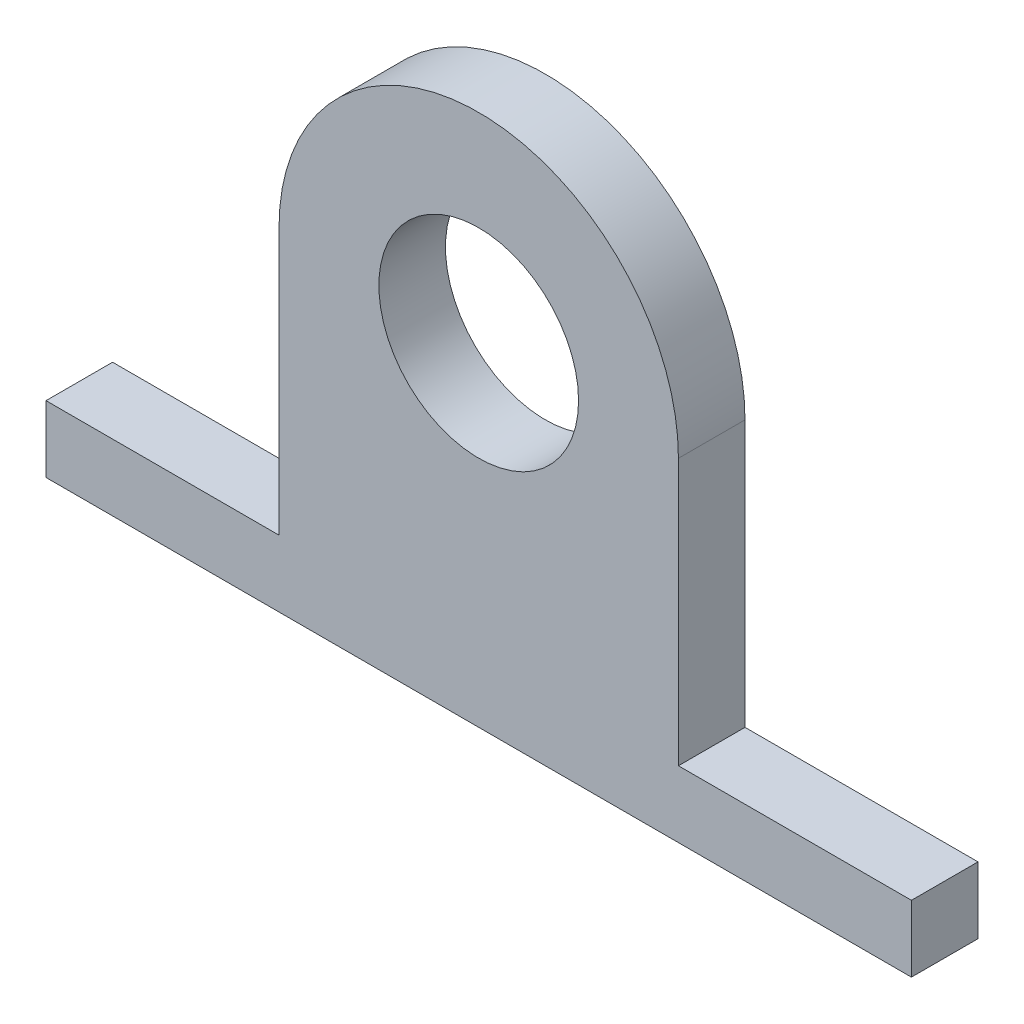
ISO-10303-21;
HEADER;
FILE_DESCRIPTION(('STEP AP214'),'2;1');
FILE_NAME('part.step','',(''),(''),'','','');
FILE_SCHEMA(('AUTOMOTIVE_DESIGN { 1 0 10303 214 1 1 1 1 }'));
ENDSEC;
DATA;
#1=APPLICATION_CONTEXT('core data for automotive mechanical design processes');
#2=APPLICATION_PROTOCOL_DEFINITION('international standard','automotive_design',2000,#1);
#3=PRODUCT_CONTEXT('',#1,'mechanical');
#4=PRODUCT('Part','Part','',(#3));
#5=PRODUCT_RELATED_PRODUCT_CATEGORY('part','',(#4));
#6=PRODUCT_DEFINITION_FORMATION('','',#4);
#7=PRODUCT_DEFINITION_CONTEXT('part definition',#1,'design');
#8=PRODUCT_DEFINITION('design','',#6,#7);
#9=PRODUCT_DEFINITION_SHAPE('','',#8);
#10=(LENGTH_UNIT() NAMED_UNIT(*) SI_UNIT(.MILLI.,.METRE.));
#11=(NAMED_UNIT(*) PLANE_ANGLE_UNIT() SI_UNIT($,.RADIAN.));
#12=(NAMED_UNIT(*) SI_UNIT($,.STERADIAN.) SOLID_ANGLE_UNIT());
#13=UNCERTAINTY_MEASURE_WITH_UNIT(LENGTH_MEASURE(1.E-05),#10,'distance_accuracy_value','');
#14=(GEOMETRIC_REPRESENTATION_CONTEXT(3) GLOBAL_UNCERTAINTY_ASSIGNED_CONTEXT((#13)) GLOBAL_UNIT_ASSIGNED_CONTEXT((#10,
#11,#12)) REPRESENTATION_CONTEXT('',''));
#15=CARTESIAN_POINT('',(0.,0.,0.));
#16=DIRECTION('',(0.,0.,1.));
#17=DIRECTION('',(1.,0.,0.));
#18=AXIS2_PLACEMENT_3D('',#15,#16,#17);
#19=CARTESIAN_POINT('',(0.,50.,10.));
#20=DIRECTION('',(0.,0.,1.));
#21=DIRECTION('',(1.,0.,0.));
#22=AXIS2_PLACEMENT_3D('',#19,#20,#21);
#23=PLANE('',#22);
#24=DIRECTION('',(0.,-1.,0.));
#25=VECTOR('',#24,1.);
#26=CARTESIAN_POINT('',(-65.,0.,10.));
#27=LINE('',#26,#25);
#28=CARTESIAN_POINT('',(-65.,10.,10.));
#29=VERTEX_POINT('',#28);
#30=CARTESIAN_POINT('',(-65.,0.,10.));
#31=VERTEX_POINT('',#30);
#32=EDGE_CURVE('E145',#29,#31,#27,.T.);
#33=ORIENTED_EDGE('',*,*,#32,.T.);
#34=DIRECTION('',(1.,0.,0.));
#35=VECTOR('',#34,1.);
#36=CARTESIAN_POINT('',(-65.,0.,10.));
#37=LINE('',#36,#35);
#38=CARTESIAN_POINT('',(65.,0.,10.));
#39=VERTEX_POINT('',#38);
#40=EDGE_CURVE('E93',#31,#39,#37,.T.);
#41=ORIENTED_EDGE('',*,*,#40,.T.);
#42=DIRECTION('',(0.,1.,0.));
#43=VECTOR('',#42,1.);
#44=CARTESIAN_POINT('',(65.,0.,10.));
#45=LINE('',#44,#43);
#46=CARTESIAN_POINT('',(65.,10.,10.));
#47=VERTEX_POINT('',#46);
#48=EDGE_CURVE('E160',#39,#47,#45,.T.);
#49=ORIENTED_EDGE('',*,*,#48,.T.);
#50=DIRECTION('',(-1.,0.,0.));
#51=VECTOR('',#50,1.);
#52=CARTESIAN_POINT('',(65.,10.,10.));
#53=LINE('',#52,#51);
#54=CARTESIAN_POINT('',(30.,10.,10.));
#55=VERTEX_POINT('',#54);
#56=EDGE_CURVE('E173',#47,#55,#53,.T.);
#57=ORIENTED_EDGE('',*,*,#56,.T.);
#58=DIRECTION('',(0.,1.,0.));
#59=VECTOR('',#58,1.);
#60=CARTESIAN_POINT('',(30.,10.,10.));
#61=LINE('',#60,#59);
#62=CARTESIAN_POINT('',(30.,50.,10.));
#63=VERTEX_POINT('',#62);
#64=EDGE_CURVE('E112',#55,#63,#61,.T.);
#65=ORIENTED_EDGE('',*,*,#64,.T.);
#66=CARTESIAN_POINT('',(0.,50.,10.));
#67=DIRECTION('',(0.,0.,1.));
#68=DIRECTION('',(1.,0.,0.));
#69=AXIS2_PLACEMENT_3D('',#66,#67,#68);
#70=CIRCLE('',#69,30.);
#71=CARTESIAN_POINT('',(-30.,50.,10.));
#72=VERTEX_POINT('',#71);
#73=EDGE_CURVE('E106',#63,#72,#70,.T.);
#74=ORIENTED_EDGE('',*,*,#73,.T.);
#75=DIRECTION('',(0.,-1.,0.));
#76=VECTOR('',#75,1.);
#77=CARTESIAN_POINT('',(-30.,10.,10.));
#78=LINE('',#77,#76);
#79=CARTESIAN_POINT('',(-30.,10.,10.));
#80=VERTEX_POINT('',#79);
#81=EDGE_CURVE('E110',#72,#80,#78,.T.);
#82=ORIENTED_EDGE('',*,*,#81,.T.);
#83=DIRECTION('',(-1.,0.,0.));
#84=VECTOR('',#83,1.);
#85=CARTESIAN_POINT('',(-65.,10.,10.));
#86=LINE('',#85,#84);
#87=EDGE_CURVE('E50',#80,#29,#86,.T.);
#88=ORIENTED_EDGE('',*,*,#87,.T.);
#89=EDGE_LOOP('',(#33,#41,#49,#57,#65,#74,#82,#88));
#90=FACE_BOUND('',#89,.T.);
#91=CARTESIAN_POINT('',(0.,50.,10.));
#92=DIRECTION('',(0.,0.,1.));
#93=DIRECTION('',(1.,0.,0.));
#94=AXIS2_PLACEMENT_3D('',#91,#92,#93);
#95=CIRCLE('',#94,15.);
#96=CARTESIAN_POINT('',(15.,50.,10.));
#97=VERTEX_POINT('',#96);
#98=EDGE_CURVE('E134',#97,#97,#95,.T.);
#99=ORIENTED_EDGE('',*,*,#98,.F.);
#100=EDGE_LOOP('',(#99));
#101=FACE_BOUND('',#100,.T.);
#102=ADVANCED_FACE('F33',(#90,#101),#23,.T.);
#103=CARTESIAN_POINT('',(0.,50.,0.));
#104=DIRECTION('',(0.,0.,1.));
#105=DIRECTION('',(1.,0.,0.));
#106=AXIS2_PLACEMENT_3D('',#103,#104,#105);
#107=PLANE('',#106);
#108=DIRECTION('',(0.,-1.,0.));
#109=VECTOR('',#108,1.);
#110=CARTESIAN_POINT('',(-65.,0.,0.));
#111=LINE('',#110,#109);
#112=CARTESIAN_POINT('',(-65.,10.,0.));
#113=VERTEX_POINT('',#112);
#114=CARTESIAN_POINT('',(-65.,0.,0.));
#115=VERTEX_POINT('',#114);
#116=EDGE_CURVE('E130',#113,#115,#111,.T.);
#117=ORIENTED_EDGE('',*,*,#116,.F.);
#118=DIRECTION('',(-1.,0.,0.));
#119=VECTOR('',#118,1.);
#120=CARTESIAN_POINT('',(-65.,10.,0.));
#121=LINE('',#120,#119);
#122=CARTESIAN_POINT('',(-30.,10.,0.));
#123=VERTEX_POINT('',#122);
#124=EDGE_CURVE('E85',#123,#113,#121,.T.);
#125=ORIENTED_EDGE('',*,*,#124,.F.);
#126=DIRECTION('',(0.,-1.,0.));
#127=VECTOR('',#126,1.);
#128=CARTESIAN_POINT('',(-30.,10.,0.));
#129=LINE('',#128,#127);
#130=CARTESIAN_POINT('',(-30.,50.,0.));
#131=VERTEX_POINT('',#130);
#132=EDGE_CURVE('E79',#131,#123,#129,.T.);
#133=ORIENTED_EDGE('',*,*,#132,.F.);
#134=CARTESIAN_POINT('',(0.,50.,0.));
#135=DIRECTION('',(0.,0.,1.));
#136=DIRECTION('',(1.,0.,0.));
#137=AXIS2_PLACEMENT_3D('',#134,#135,#136);
#138=CIRCLE('',#137,30.);
#139=CARTESIAN_POINT('',(30.,50.,0.));
#140=VERTEX_POINT('',#139);
#141=EDGE_CURVE('E120',#140,#131,#138,.T.);
#142=ORIENTED_EDGE('',*,*,#141,.F.);
#143=DIRECTION('',(0.,1.,0.));
#144=VECTOR('',#143,1.);
#145=CARTESIAN_POINT('',(30.,10.,0.));
#146=LINE('',#145,#144);
#147=CARTESIAN_POINT('',(30.,10.,0.));
#148=VERTEX_POINT('',#147);
#149=EDGE_CURVE('E140',#148,#140,#146,.T.);
#150=ORIENTED_EDGE('',*,*,#149,.F.);
#151=DIRECTION('',(-1.,0.,0.));
#152=VECTOR('',#151,1.);
#153=CARTESIAN_POINT('',(65.,10.,0.));
#154=LINE('',#153,#152);
#155=CARTESIAN_POINT('',(65.,10.,0.));
#156=VERTEX_POINT('',#155);
#157=EDGE_CURVE('E138',#156,#148,#154,.T.);
#158=ORIENTED_EDGE('',*,*,#157,.F.);
#159=DIRECTION('',(0.,1.,0.));
#160=VECTOR('',#159,1.);
#161=CARTESIAN_POINT('',(65.,0.,0.));
#162=LINE('',#161,#160);
#163=CARTESIAN_POINT('',(65.,0.,0.));
#164=VERTEX_POINT('',#163);
#165=EDGE_CURVE('E136',#164,#156,#162,.T.);
#166=ORIENTED_EDGE('',*,*,#165,.F.);
#167=DIRECTION('',(1.,0.,0.));
#168=VECTOR('',#167,1.);
#169=CARTESIAN_POINT('',(-65.,0.,0.));
#170=LINE('',#169,#168);
#171=EDGE_CURVE('E133',#115,#164,#170,.T.);
#172=ORIENTED_EDGE('',*,*,#171,.F.);
#173=EDGE_LOOP('',(#117,#125,#133,#142,#150,#158,#166,#172));
#174=FACE_BOUND('',#173,.T.);
#175=CARTESIAN_POINT('',(0.,50.,0.));
#176=DIRECTION('',(0.,0.,1.));
#177=DIRECTION('',(1.,0.,0.));
#178=AXIS2_PLACEMENT_3D('',#175,#176,#177);
#179=CIRCLE('',#178,15.);
#180=CARTESIAN_POINT('',(15.,50.,0.));
#181=VERTEX_POINT('',#180);
#182=EDGE_CURVE('E179',#181,#181,#179,.T.);
#183=ORIENTED_EDGE('',*,*,#182,.T.);
#184=EDGE_LOOP('',(#183));
#185=FACE_BOUND('',#184,.T.);
#186=ADVANCED_FACE('F164',(#174,#185),#107,.F.);
#187=CARTESIAN_POINT('',(-65.,0.,10.));
#188=DIRECTION('',(1.,0.,0.));
#189=DIRECTION('',(0.,0.,-1.));
#190=AXIS2_PLACEMENT_3D('',#187,#188,#189);
#191=PLANE('',#190);
#192=ORIENTED_EDGE('',*,*,#116,.T.);
#193=DIRECTION('',(0.,0.,-1.));
#194=VECTOR('',#193,1.);
#195=CARTESIAN_POINT('',(-65.,0.,10.));
#196=LINE('',#195,#194);
#197=EDGE_CURVE('E11',#31,#115,#196,.T.);
#198=ORIENTED_EDGE('',*,*,#197,.F.);
#199=ORIENTED_EDGE('',*,*,#32,.F.);
#200=DIRECTION('',(0.,0.,-1.));
#201=VECTOR('',#200,1.);
#202=CARTESIAN_POINT('',(-65.,10.,10.));
#203=LINE('',#202,#201);
#204=EDGE_CURVE('E126',#29,#113,#203,.T.);
#205=ORIENTED_EDGE('',*,*,#204,.T.);
#206=EDGE_LOOP('',(#192,#198,#199,#205));
#207=FACE_BOUND('',#206,.T.);
#208=ADVANCED_FACE('F35',(#207),#191,.F.);
#209=CARTESIAN_POINT('',(-65.,0.,10.));
#210=DIRECTION('',(0.,1.,0.));
#211=DIRECTION('',(-1.,0.,0.));
#212=AXIS2_PLACEMENT_3D('',#209,#210,#211);
#213=PLANE('',#212);
#214=ORIENTED_EDGE('',*,*,#171,.T.);
#215=DIRECTION('',(0.,0.,-1.));
#216=VECTOR('',#215,1.);
#217=CARTESIAN_POINT('',(65.,0.,10.));
#218=LINE('',#217,#216);
#219=EDGE_CURVE('E42',#39,#164,#218,.T.);
#220=ORIENTED_EDGE('',*,*,#219,.F.);
#221=ORIENTED_EDGE('',*,*,#40,.F.);
#222=ORIENTED_EDGE('',*,*,#197,.T.);
#223=EDGE_LOOP('',(#214,#220,#221,#222));
#224=FACE_BOUND('',#223,.T.);
#225=ADVANCED_FACE('F207',(#224),#213,.F.);
#226=CARTESIAN_POINT('',(65.,0.,10.));
#227=DIRECTION('',(-1.,0.,0.));
#228=DIRECTION('',(0.,0.,1.));
#229=AXIS2_PLACEMENT_3D('',#226,#227,#228);
#230=PLANE('',#229);
#231=ORIENTED_EDGE('',*,*,#165,.T.);
#232=DIRECTION('',(0.,0.,-1.));
#233=VECTOR('',#232,1.);
#234=CARTESIAN_POINT('',(65.,10.,10.));
#235=LINE('',#234,#233);
#236=EDGE_CURVE('E152',#47,#156,#235,.T.);
#237=ORIENTED_EDGE('',*,*,#236,.F.);
#238=ORIENTED_EDGE('',*,*,#48,.F.);
#239=ORIENTED_EDGE('',*,*,#219,.T.);
#240=EDGE_LOOP('',(#231,#237,#238,#239));
#241=FACE_BOUND('',#240,.T.);
#242=ADVANCED_FACE('F158',(#241),#230,.F.);
#243=CARTESIAN_POINT('',(65.,10.,10.));
#244=DIRECTION('',(0.,-1.,0.));
#245=DIRECTION('',(1.,0.,0.));
#246=AXIS2_PLACEMENT_3D('',#243,#244,#245);
#247=PLANE('',#246);
#248=ORIENTED_EDGE('',*,*,#157,.T.);
#249=DIRECTION('',(0.,0.,-1.));
#250=VECTOR('',#249,1.);
#251=CARTESIAN_POINT('',(30.,10.,10.));
#252=LINE('',#251,#250);
#253=EDGE_CURVE('E149',#55,#148,#252,.T.);
#254=ORIENTED_EDGE('',*,*,#253,.F.);
#255=ORIENTED_EDGE('',*,*,#56,.F.);
#256=ORIENTED_EDGE('',*,*,#236,.T.);
#257=EDGE_LOOP('',(#248,#254,#255,#256));
#258=FACE_BOUND('',#257,.T.);
#259=ADVANCED_FACE('F169',(#258),#247,.F.);
#260=CARTESIAN_POINT('',(30.,10.,10.));
#261=DIRECTION('',(-1.,0.,0.));
#262=DIRECTION('',(0.,0.,1.));
#263=AXIS2_PLACEMENT_3D('',#260,#261,#262);
#264=PLANE('',#263);
#265=ORIENTED_EDGE('',*,*,#149,.T.);
#266=DIRECTION('',(0.,0.,-1.));
#267=VECTOR('',#266,1.);
#268=CARTESIAN_POINT('',(30.,50.,10.));
#269=LINE('',#268,#267);
#270=EDGE_CURVE('E121',#63,#140,#269,.T.);
#271=ORIENTED_EDGE('',*,*,#270,.F.);
#272=ORIENTED_EDGE('',*,*,#64,.F.);
#273=ORIENTED_EDGE('',*,*,#253,.T.);
#274=EDGE_LOOP('',(#265,#271,#272,#273));
#275=FACE_BOUND('',#274,.T.);
#276=ADVANCED_FACE('F172',(#275),#264,.F.);
#277=CARTESIAN_POINT('',(0.,50.,10.));
#278=DIRECTION('',(0.,0.,-1.));
#279=DIRECTION('',(-1.,0.,0.));
#280=AXIS2_PLACEMENT_3D('',#277,#278,#279);
#281=CYLINDRICAL_SURFACE('',#280,30.);
#282=ORIENTED_EDGE('',*,*,#141,.T.);
#283=DIRECTION('',(0.,0.,-1.));
#284=VECTOR('',#283,1.);
#285=CARTESIAN_POINT('',(-30.,50.,10.));
#286=LINE('',#285,#284);
#287=EDGE_CURVE('E117',#72,#131,#286,.T.);
#288=ORIENTED_EDGE('',*,*,#287,.F.);
#289=ORIENTED_EDGE('',*,*,#73,.F.);
#290=ORIENTED_EDGE('',*,*,#270,.T.);
#291=EDGE_LOOP('',(#282,#288,#289,#290));
#292=FACE_BOUND('',#291,.T.);
#293=ADVANCED_FACE('F118',(#292),#281,.T.);
#294=CARTESIAN_POINT('',(-30.,10.,10.));
#295=DIRECTION('',(1.,0.,0.));
#296=DIRECTION('',(0.,0.,-1.));
#297=AXIS2_PLACEMENT_3D('',#294,#295,#296);
#298=PLANE('',#297);
#299=ORIENTED_EDGE('',*,*,#132,.T.);
#300=DIRECTION('',(0.,0.,-1.));
#301=VECTOR('',#300,1.);
#302=CARTESIAN_POINT('',(-30.,10.,10.));
#303=LINE('',#302,#301);
#304=EDGE_CURVE('E122',#80,#123,#303,.T.);
#305=ORIENTED_EDGE('',*,*,#304,.F.);
#306=ORIENTED_EDGE('',*,*,#81,.F.);
#307=ORIENTED_EDGE('',*,*,#287,.T.);
#308=EDGE_LOOP('',(#299,#305,#306,#307));
#309=FACE_BOUND('',#308,.T.);
#310=ADVANCED_FACE('F124',(#309),#298,.F.);
#311=CARTESIAN_POINT('',(-65.,10.,10.));
#312=DIRECTION('',(0.,-1.,0.));
#313=DIRECTION('',(1.,0.,0.));
#314=AXIS2_PLACEMENT_3D('',#311,#312,#313);
#315=PLANE('',#314);
#316=ORIENTED_EDGE('',*,*,#124,.T.);
#317=ORIENTED_EDGE('',*,*,#204,.F.);
#318=ORIENTED_EDGE('',*,*,#87,.F.);
#319=ORIENTED_EDGE('',*,*,#304,.T.);
#320=EDGE_LOOP('',(#316,#317,#318,#319));
#321=FACE_BOUND('',#320,.T.);
#322=ADVANCED_FACE('F195',(#321),#315,.F.);
#323=CARTESIAN_POINT('',(0.,50.,10.));
#324=DIRECTION('',(0.,0.,-1.));
#325=DIRECTION('',(-1.,0.,0.));
#326=AXIS2_PLACEMENT_3D('',#323,#324,#325);
#327=CYLINDRICAL_SURFACE('',#326,15.);
#328=ORIENTED_EDGE('',*,*,#98,.T.);
#329=EDGE_LOOP('',(#328));
#330=FACE_BOUND('',#329,.T.);
#331=ORIENTED_EDGE('',*,*,#182,.F.);
#332=EDGE_LOOP('',(#331));
#333=FACE_BOUND('',#332,.T.);
#334=ADVANCED_FACE('F185',(#330,#333),#327,.F.);
#335=CLOSED_SHELL('',(#102,#186,#208,#225,#242,#259,#276,#293,#310,#322,#334));
#336=MANIFOLD_SOLID_BREP('B2',#335);
#337=ADVANCED_BREP_SHAPE_REPRESENTATION('',(#18,#336),#14);
#338=SHAPE_DEFINITION_REPRESENTATION(#9,#337);
ENDSEC;
END-ISO-10303-21;
